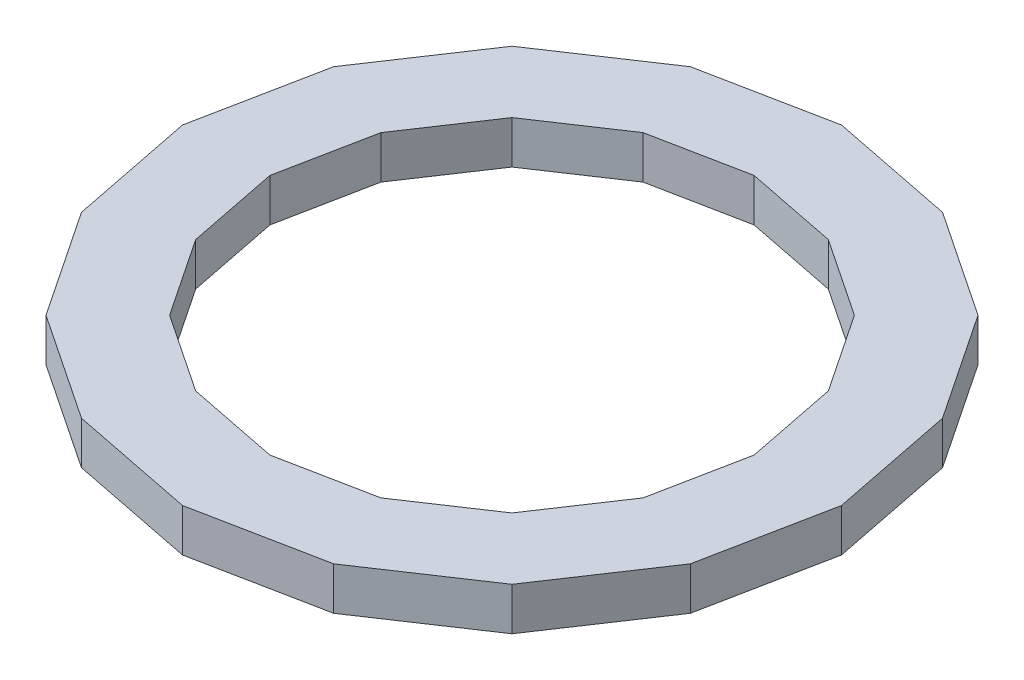
ISO-10303-21;
HEADER;
FILE_DESCRIPTION(('STEP AP214'),'2;1');
FILE_NAME('part.step','',(''),(''),'','','');
FILE_SCHEMA(('AUTOMOTIVE_DESIGN { 1 0 10303 214 1 1 1 1 }'));
ENDSEC;
DATA;
#1=APPLICATION_CONTEXT('core data for automotive mechanical design processes');
#2=APPLICATION_PROTOCOL_DEFINITION('international standard','automotive_design',2000,#1);
#3=PRODUCT_CONTEXT('',#1,'mechanical');
#4=PRODUCT('Part','Part','',(#3));
#5=PRODUCT_RELATED_PRODUCT_CATEGORY('part','',(#4));
#6=PRODUCT_DEFINITION_FORMATION('','',#4);
#7=PRODUCT_DEFINITION_CONTEXT('part definition',#1,'design');
#8=PRODUCT_DEFINITION('design','',#6,#7);
#9=PRODUCT_DEFINITION_SHAPE('','',#8);
#10=(LENGTH_UNIT() NAMED_UNIT(*) SI_UNIT(.MILLI.,.METRE.));
#11=(NAMED_UNIT(*) PLANE_ANGLE_UNIT() SI_UNIT($,.RADIAN.));
#12=(NAMED_UNIT(*) SI_UNIT($,.STERADIAN.) SOLID_ANGLE_UNIT());
#13=UNCERTAINTY_MEASURE_WITH_UNIT(LENGTH_MEASURE(1.E-05),#10,'distance_accuracy_value','');
#14=(GEOMETRIC_REPRESENTATION_CONTEXT(3) GLOBAL_UNCERTAINTY_ASSIGNED_CONTEXT((#13)) GLOBAL_UNIT_ASSIGNED_CONTEXT((#10,
#11,#12)) REPRESENTATION_CONTEXT('',''));
#15=CARTESIAN_POINT('',(0.,0.,0.));
#16=DIRECTION('',(0.,0.,1.));
#17=DIRECTION('',(1.,0.,0.));
#18=AXIS2_PLACEMENT_3D('',#15,#16,#17);
#19=CARTESIAN_POINT('',(0.,19.05,0.));
#20=DIRECTION('',(0.,1.,0.));
#21=DIRECTION('',(0.,0.,1.));
#22=AXIS2_PLACEMENT_3D('',#19,#20,#21);
#23=PLANE('',#22);
#24=DIRECTION('',(0.195090322016117,0.,-0.980785280403233));
#25=VECTOR('',#24,1.);
#26=CARTESIAN_POINT('',(135.321205935206,19.05,56.0518787750433));
#27=LINE('',#26,#25);
#28=CARTESIAN_POINT('',(135.321205935206,19.05,56.0518787750433));
#29=VERTEX_POINT('',#28);
#30=CARTESIAN_POINT('',(146.470617838427,19.05,-1.60288341468619E-12));
#31=VERTEX_POINT('',#30);
#32=EDGE_CURVE('E385',#29,#31,#27,.T.);
#33=ORIENTED_EDGE('',*,*,#32,.T.);
#34=DIRECTION('',(-0.195090322016139,0.,-0.980785280403228));
#35=VECTOR('',#34,1.);
#36=CARTESIAN_POINT('',(146.470617838427,19.05,-1.60288341468619E-12));
#37=LINE('',#36,#35);
#38=CARTESIAN_POINT('',(135.321205935205,19.05,-56.0518787750461));
#39=VERTEX_POINT('',#38);
#40=EDGE_CURVE('E388',#31,#39,#37,.T.);
#41=ORIENTED_EDGE('',*,*,#40,.T.);
#42=DIRECTION('',(-0.555570233019611,0.,-0.831469612302539));
#43=VECTOR('',#42,1.);
#44=CARTESIAN_POINT('',(135.321205935205,19.05,-56.0518787750461));
#45=LINE('',#44,#43);
#46=CARTESIAN_POINT('',(103.570367118134,19.05,-103.570367118136));
#47=VERTEX_POINT('',#46);
#48=EDGE_CURVE('E391',#39,#47,#45,.T.);
#49=ORIENTED_EDGE('',*,*,#48,.T.);
#50=DIRECTION('',(-0.831469612302551,0.,-0.555570233019593));
#51=VECTOR('',#50,1.);
#52=CARTESIAN_POINT('',(103.570367118134,19.05,-103.570367118136));
#53=LINE('',#52,#51);
#54=CARTESIAN_POINT('',(56.0518787750433,19.05,-135.321205935206));
#55=VERTEX_POINT('',#54);
#56=EDGE_CURVE('E394',#47,#55,#53,.T.);
#57=ORIENTED_EDGE('',*,*,#56,.T.);
#58=DIRECTION('',(-0.980785280403233,0.,-0.195090322016117));
#59=VECTOR('',#58,1.);
#60=CARTESIAN_POINT('',(56.0518787750433,19.05,-135.321205935206));
#61=LINE('',#60,#59);
#62=CARTESIAN_POINT('',(-1.69308296480161E-12,19.05,-146.470617838427));
#63=VERTEX_POINT('',#62);
#64=EDGE_CURVE('E397',#55,#63,#61,.T.);
#65=ORIENTED_EDGE('',*,*,#64,.T.);
#66=DIRECTION('',(-0.980785280403228,0.,0.195090322016139));
#67=VECTOR('',#66,1.);
#68=CARTESIAN_POINT('',(-1.69308296480161E-12,19.05,-146.470617838427));
#69=LINE('',#68,#67);
#70=CARTESIAN_POINT('',(-56.0518787750461,19.05,-135.321205935205));
#71=VERTEX_POINT('',#70);
#72=EDGE_CURVE('E400',#63,#71,#69,.T.);
#73=ORIENTED_EDGE('',*,*,#72,.T.);
#74=DIRECTION('',(-0.831469612302539,0.,0.555570233019611));
#75=VECTOR('',#74,1.);
#76=CARTESIAN_POINT('',(-56.0518787750461,19.05,-135.321205935205));
#77=LINE('',#76,#75);
#78=CARTESIAN_POINT('',(-103.570367118136,19.05,-103.570367118134));
#79=VERTEX_POINT('',#78);
#80=EDGE_CURVE('E402',#71,#79,#77,.T.);
#81=ORIENTED_EDGE('',*,*,#80,.T.);
#82=DIRECTION('',(-0.555570233019593,0.,0.831469612302551));
#83=VECTOR('',#82,1.);
#84=CARTESIAN_POINT('',(-103.570367118136,19.05,-103.570367118134));
#85=LINE('',#84,#83);
#86=CARTESIAN_POINT('',(-135.321205935206,19.05,-56.0518787750431));
#87=VERTEX_POINT('',#86);
#88=EDGE_CURVE('E404',#79,#87,#85,.T.);
#89=ORIENTED_EDGE('',*,*,#88,.T.);
#90=DIRECTION('',(-0.195090322016117,0.,0.980785280403233));
#91=VECTOR('',#90,1.);
#92=CARTESIAN_POINT('',(-135.321205935206,19.05,-56.0518787750431));
#93=LINE('',#92,#91);
#94=CARTESIAN_POINT('',(-146.470617838427,19.05,1.65838521613107E-12));
#95=VERTEX_POINT('',#94);
#96=EDGE_CURVE('E406',#87,#95,#93,.T.);
#97=ORIENTED_EDGE('',*,*,#96,.T.);
#98=DIRECTION('',(0.195090322016139,0.,0.980785280403228));
#99=VECTOR('',#98,1.);
#100=CARTESIAN_POINT('',(-146.470617838427,19.05,1.65838521613107E-12));
#101=LINE('',#100,#99);
#102=CARTESIAN_POINT('',(-135.321205935205,19.05,56.0518787750461));
#103=VERTEX_POINT('',#102);
#104=EDGE_CURVE('E408',#95,#103,#101,.T.);
#105=ORIENTED_EDGE('',*,*,#104,.T.);
#106=DIRECTION('',(0.555570233019611,0.,0.831469612302539));
#107=VECTOR('',#106,1.);
#108=CARTESIAN_POINT('',(-135.321205935205,19.05,56.0518787750461));
#109=LINE('',#108,#107);
#110=CARTESIAN_POINT('',(-103.570367118134,19.05,103.570367118136));
#111=VERTEX_POINT('',#110);
#112=EDGE_CURVE('E410',#103,#111,#109,.T.);
#113=ORIENTED_EDGE('',*,*,#112,.T.);
#114=DIRECTION('',(0.831469612302551,0.,0.555570233019593));
#115=VECTOR('',#114,1.);
#116=CARTESIAN_POINT('',(-103.570367118134,19.05,103.570367118136));
#117=LINE('',#116,#115);
#118=CARTESIAN_POINT('',(-56.0518787750431,19.05,135.321205935206));
#119=VERTEX_POINT('',#118);
#120=EDGE_CURVE('E412',#111,#119,#117,.T.);
#121=ORIENTED_EDGE('',*,*,#120,.T.);
#122=DIRECTION('',(0.980785280403233,0.,0.195090322016118));
#123=VECTOR('',#122,1.);
#124=CARTESIAN_POINT('',(-56.0518787750431,19.05,135.321205935206));
#125=LINE('',#124,#123);
#126=CARTESIAN_POINT('',(1.5317509390031E-12,19.05,146.470617838427));
#127=VERTEX_POINT('',#126);
#128=EDGE_CURVE('E414',#119,#127,#125,.T.);
#129=ORIENTED_EDGE('',*,*,#128,.T.);
#130=DIRECTION('',(0.980785280403228,0.,-0.195090322016139));
#131=VECTOR('',#130,1.);
#132=CARTESIAN_POINT('',(1.5317509390031E-12,19.05,146.470617838427));
#133=LINE('',#132,#131);
#134=CARTESIAN_POINT('',(56.0518787750462,19.05,135.321205935205));
#135=VERTEX_POINT('',#134);
#136=EDGE_CURVE('E416',#127,#135,#133,.T.);
#137=ORIENTED_EDGE('',*,*,#136,.T.);
#138=DIRECTION('',(0.831469612302539,0.,-0.555570233019611));
#139=VECTOR('',#138,1.);
#140=CARTESIAN_POINT('',(56.0518787750462,19.05,135.321205935205));
#141=LINE('',#140,#139);
#142=CARTESIAN_POINT('',(103.570367118136,19.05,103.570367118134));
#143=VERTEX_POINT('',#142);
#144=EDGE_CURVE('E418',#135,#143,#141,.T.);
#145=ORIENTED_EDGE('',*,*,#144,.T.);
#146=DIRECTION('',(0.555570233019593,0.,-0.831469612302551));
#147=VECTOR('',#146,1.);
#148=CARTESIAN_POINT('',(103.570367118136,19.05,103.570367118134));
#149=LINE('',#148,#147);
#150=EDGE_CURVE('E420',#143,#29,#149,.T.);
#151=ORIENTED_EDGE('',*,*,#150,.T.);
#152=EDGE_LOOP('',(#33,#41,#49,#57,#65,#73,#81,#89,#97,#105,#113,#121,#129,#137,#145,#151));
#153=FACE_BOUND('',#152,.T.);
#154=DIRECTION('',(-0.195090322016139,0.,-0.980785280403228));
#155=VECTOR('',#154,1.);
#156=CARTESIAN_POINT('',(107.62419471069,19.05,-1.21440166598668E-12));
#157=LINE('',#156,#155);
#158=CARTESIAN_POINT('',(107.62419471069,19.05,-1.21440166598668E-12));
#159=VERTEX_POINT('',#158);
#160=CARTESIAN_POINT('',(99.4317906962157,19.05,-41.1859962374167));
#161=VERTEX_POINT('',#160);
#162=EDGE_CURVE('E252',#159,#161,#157,.T.);
#163=ORIENTED_EDGE('',*,*,#162,.F.);
#164=DIRECTION('',(0.195090322016118,0.,-0.980785280403233));
#165=VECTOR('',#164,1.);
#166=CARTESIAN_POINT('',(99.4317906962166,19.05,41.1859962374146));
#167=LINE('',#166,#165);
#168=CARTESIAN_POINT('',(99.4317906962166,19.05,41.1859962374146));
#169=VERTEX_POINT('',#168);
#170=EDGE_CURVE('E244',#169,#159,#167,.T.);
#171=ORIENTED_EDGE('',*,*,#170,.F.);
#172=DIRECTION('',(0.555570233019593,0.,-0.831469612302552));
#173=VECTOR('',#172,1.);
#174=CARTESIAN_POINT('',(76.1017978996712,19.05,76.1017978996696));
#175=LINE('',#174,#173);
#176=CARTESIAN_POINT('',(76.1017978996712,19.05,76.1017978996696));
#177=VERTEX_POINT('',#176);
#178=EDGE_CURVE('E302',#177,#169,#175,.T.);
#179=ORIENTED_EDGE('',*,*,#178,.F.);
#180=DIRECTION('',(0.831469612302539,0.,-0.555570233019611));
#181=VECTOR('',#180,1.);
#182=CARTESIAN_POINT('',(41.1859962374168,19.05,99.4317906962157));
#183=LINE('',#182,#181);
#184=CARTESIAN_POINT('',(41.1859962374168,19.05,99.4317906962157));
#185=VERTEX_POINT('',#184);
#186=EDGE_CURVE('E299',#185,#177,#183,.T.);
#187=ORIENTED_EDGE('',*,*,#186,.F.);
#188=DIRECTION('',(0.980785280403228,0.,-0.195090322016139));
#189=VECTOR('',#188,1.);
#190=CARTESIAN_POINT('',(1.19853946211757E-12,19.05,107.62419471069));
#191=LINE('',#190,#189);
#192=CARTESIAN_POINT('',(1.19853946211757E-12,19.05,107.62419471069));
#193=VERTEX_POINT('',#192);
#194=EDGE_CURVE('E297',#193,#185,#191,.T.);
#195=ORIENTED_EDGE('',*,*,#194,.F.);
#196=DIRECTION('',(0.980785280403233,0.,0.195090322016117));
#197=VECTOR('',#196,1.);
#198=CARTESIAN_POINT('',(-41.1859962374146,19.05,99.4317906962166));
#199=LINE('',#198,#197);
#200=CARTESIAN_POINT('',(-41.1859962374146,19.05,99.4317906962166));
#201=VERTEX_POINT('',#200);
#202=EDGE_CURVE('E295',#201,#193,#199,.T.);
#203=ORIENTED_EDGE('',*,*,#202,.F.);
#204=DIRECTION('',(0.831469612302551,0.,0.555570233019593));
#205=VECTOR('',#204,1.);
#206=CARTESIAN_POINT('',(-76.1017978996696,19.05,76.1017978996713));
#207=LINE('',#206,#205);
#208=CARTESIAN_POINT('',(-76.1017978996696,19.05,76.1017978996713));
#209=VERTEX_POINT('',#208);
#210=EDGE_CURVE('E292',#209,#201,#207,.T.);
#211=ORIENTED_EDGE('',*,*,#210,.F.);
#212=DIRECTION('',(0.555570233019611,0.,0.831469612302539));
#213=VECTOR('',#212,1.);
#214=CARTESIAN_POINT('',(-99.4317906962158,19.05,41.1859962374168));
#215=LINE('',#214,#213);
#216=CARTESIAN_POINT('',(-99.4317906962158,19.05,41.1859962374168));
#217=VERTEX_POINT('',#216);
#218=EDGE_CURVE('E290',#217,#209,#215,.T.);
#219=ORIENTED_EDGE('',*,*,#218,.F.);
#220=DIRECTION('',(0.195090322016139,0.,0.980785280403228));
#221=VECTOR('',#220,1.);
#222=CARTESIAN_POINT('',(-107.62419471069,19.05,1.20736281239143E-12));
#223=LINE('',#222,#221);
#224=CARTESIAN_POINT('',(-107.62419471069,19.05,1.20736281239143E-12));
#225=VERTEX_POINT('',#224);
#226=EDGE_CURVE('E288',#225,#217,#223,.T.);
#227=ORIENTED_EDGE('',*,*,#226,.F.);
#228=DIRECTION('',(-0.195090322016118,0.,0.980785280403233));
#229=VECTOR('',#228,1.);
#230=CARTESIAN_POINT('',(-99.4317906962167,19.05,-41.1859962374146));
#231=LINE('',#230,#229);
#232=CARTESIAN_POINT('',(-99.4317906962167,19.05,-41.1859962374146));
#233=VERTEX_POINT('',#232);
#234=EDGE_CURVE('E286',#233,#225,#231,.T.);
#235=ORIENTED_EDGE('',*,*,#234,.F.);
#236=DIRECTION('',(-0.555570233019593,0.,0.831469612302552));
#237=VECTOR('',#236,1.);
#238=CARTESIAN_POINT('',(-76.1017978996713,19.05,-76.1017978996695));
#239=LINE('',#238,#237);
#240=CARTESIAN_POINT('',(-76.1017978996713,19.05,-76.1017978996695));
#241=VERTEX_POINT('',#240);
#242=EDGE_CURVE('E284',#241,#233,#239,.T.);
#243=ORIENTED_EDGE('',*,*,#242,.F.);
#244=DIRECTION('',(-0.831469612302539,0.,0.555570233019612));
#245=VECTOR('',#244,1.);
#246=CARTESIAN_POINT('',(-41.1859962374168,19.05,-99.4317906962157));
#247=LINE('',#246,#245);
#248=CARTESIAN_POINT('',(-41.1859962374168,19.05,-99.4317906962157));
#249=VERTEX_POINT('',#248);
#250=EDGE_CURVE('E282',#249,#241,#247,.T.);
#251=ORIENTED_EDGE('',*,*,#250,.F.);
#252=DIRECTION('',(-0.980785280403228,0.,0.195090322016139));
#253=VECTOR('',#252,1.);
#254=CARTESIAN_POINT('',(-1.22818363873053E-12,19.05,-107.62419471069));
#255=LINE('',#254,#253);
#256=CARTESIAN_POINT('',(-1.22818363873053E-12,19.05,-107.62419471069));
#257=VERTEX_POINT('',#256);
#258=EDGE_CURVE('E280',#257,#249,#255,.T.);
#259=ORIENTED_EDGE('',*,*,#258,.F.);
#260=DIRECTION('',(-0.980785280403233,0.,-0.195090322016117));
#261=VECTOR('',#260,1.);
#262=CARTESIAN_POINT('',(41.1859962374146,19.05,-99.4317906962166));
#263=LINE('',#262,#261);
#264=CARTESIAN_POINT('',(41.1859962374146,19.05,-99.4317906962166));
#265=VERTEX_POINT('',#264);
#266=EDGE_CURVE('E277',#265,#257,#263,.T.);
#267=ORIENTED_EDGE('',*,*,#266,.F.);
#268=DIRECTION('',(-0.831469612302552,0.,-0.555570233019593));
#269=VECTOR('',#268,1.);
#270=CARTESIAN_POINT('',(76.1017978996695,19.05,-76.1017978996713));
#271=LINE('',#270,#269);
#272=CARTESIAN_POINT('',(76.1017978996695,19.05,-76.1017978996713));
#273=VERTEX_POINT('',#272);
#274=EDGE_CURVE('E272',#273,#265,#271,.T.);
#275=ORIENTED_EDGE('',*,*,#274,.F.);
#276=DIRECTION('',(-0.555570233019612,0.,-0.831469612302539));
#277=VECTOR('',#276,1.);
#278=CARTESIAN_POINT('',(99.4317906962157,19.05,-41.1859962374167));
#279=LINE('',#278,#277);
#280=EDGE_CURVE('E265',#161,#273,#279,.T.);
#281=ORIENTED_EDGE('',*,*,#280,.F.);
#282=EDGE_LOOP('',(#163,#171,#179,#187,#195,#203,#211,#219,#227,#235,#243,#251,#259,#267,#275,#281));
#283=FACE_BOUND('',#282,.T.);
#284=ADVANCED_FACE('F35',(#153,#283),#23,.T.);
#285=CARTESIAN_POINT('',(0.,0.,0.));
#286=DIRECTION('',(0.,1.,0.));
#287=DIRECTION('',(0.,0.,1.));
#288=AXIS2_PLACEMENT_3D('',#285,#286,#287);
#289=PLANE('',#288);
#290=DIRECTION('',(0.195090322016117,0.,-0.980785280403233));
#291=VECTOR('',#290,1.);
#292=CARTESIAN_POINT('',(135.321205935206,0.,56.0518787750433));
#293=LINE('',#292,#291);
#294=CARTESIAN_POINT('',(135.321205935206,0.,56.0518787750433));
#295=VERTEX_POINT('',#294);
#296=CARTESIAN_POINT('',(146.470617838427,0.,-1.60288341468619E-12));
#297=VERTEX_POINT('',#296);
#298=EDGE_CURVE('E260',#295,#297,#293,.T.);
#299=ORIENTED_EDGE('',*,*,#298,.F.);
#300=DIRECTION('',(0.555570233019593,0.,-0.831469612302551));
#301=VECTOR('',#300,1.);
#302=CARTESIAN_POINT('',(103.570367118136,0.,103.570367118134));
#303=LINE('',#302,#301);
#304=CARTESIAN_POINT('',(103.570367118136,0.,103.570367118134));
#305=VERTEX_POINT('',#304);
#306=EDGE_CURVE('E389',#305,#295,#303,.T.);
#307=ORIENTED_EDGE('',*,*,#306,.F.);
#308=DIRECTION('',(0.831469612302539,0.,-0.555570233019611));
#309=VECTOR('',#308,1.);
#310=CARTESIAN_POINT('',(56.0518787750462,0.,135.321205935205));
#311=LINE('',#310,#309);
#312=CARTESIAN_POINT('',(56.0518787750462,0.,135.321205935205));
#313=VERTEX_POINT('',#312);
#314=EDGE_CURVE('E457',#313,#305,#311,.T.);
#315=ORIENTED_EDGE('',*,*,#314,.F.);
#316=DIRECTION('',(0.980785280403228,0.,-0.195090322016139));
#317=VECTOR('',#316,1.);
#318=CARTESIAN_POINT('',(1.5317509390031E-12,0.,146.470617838427));
#319=LINE('',#318,#317);
#320=CARTESIAN_POINT('',(1.5317509390031E-12,0.,146.470617838427));
#321=VERTEX_POINT('',#320);
#322=EDGE_CURVE('E454',#321,#313,#319,.T.);
#323=ORIENTED_EDGE('',*,*,#322,.F.);
#324=DIRECTION('',(0.980785280403233,0.,0.195090322016118));
#325=VECTOR('',#324,1.);
#326=CARTESIAN_POINT('',(-56.0518787750431,0.,135.321205935206));
#327=LINE('',#326,#325);
#328=CARTESIAN_POINT('',(-56.0518787750431,0.,135.321205935206));
#329=VERTEX_POINT('',#328);
#330=EDGE_CURVE('E452',#329,#321,#327,.T.);
#331=ORIENTED_EDGE('',*,*,#330,.F.);
#332=DIRECTION('',(0.831469612302551,0.,0.555570233019593));
#333=VECTOR('',#332,1.);
#334=CARTESIAN_POINT('',(-103.570367118134,0.,103.570367118136));
#335=LINE('',#334,#333);
#336=CARTESIAN_POINT('',(-103.570367118134,0.,103.570367118136));
#337=VERTEX_POINT('',#336);
#338=EDGE_CURVE('E450',#337,#329,#335,.T.);
#339=ORIENTED_EDGE('',*,*,#338,.F.);
#340=DIRECTION('',(0.555570233019611,0.,0.831469612302539));
#341=VECTOR('',#340,1.);
#342=CARTESIAN_POINT('',(-135.321205935205,0.,56.0518787750461));
#343=LINE('',#342,#341);
#344=CARTESIAN_POINT('',(-135.321205935205,0.,56.0518787750461));
#345=VERTEX_POINT('',#344);
#346=EDGE_CURVE('E447',#345,#337,#343,.T.);
#347=ORIENTED_EDGE('',*,*,#346,.F.);
#348=DIRECTION('',(0.195090322016139,0.,0.980785280403228));
#349=VECTOR('',#348,1.);
#350=CARTESIAN_POINT('',(-146.470617838427,0.,1.65838521613107E-12));
#351=LINE('',#350,#349);
#352=CARTESIAN_POINT('',(-146.470617838427,0.,1.65838521613107E-12));
#353=VERTEX_POINT('',#352);
#354=EDGE_CURVE('E445',#353,#345,#351,.T.);
#355=ORIENTED_EDGE('',*,*,#354,.F.);
#356=DIRECTION('',(-0.195090322016117,0.,0.980785280403233));
#357=VECTOR('',#356,1.);
#358=CARTESIAN_POINT('',(-135.321205935206,0.,-56.0518787750431));
#359=LINE('',#358,#357);
#360=CARTESIAN_POINT('',(-135.321205935206,0.,-56.0518787750431));
#361=VERTEX_POINT('',#360);
#362=EDGE_CURVE('E443',#361,#353,#359,.T.);
#363=ORIENTED_EDGE('',*,*,#362,.F.);
#364=DIRECTION('',(-0.555570233019593,0.,0.831469612302551));
#365=VECTOR('',#364,1.);
#366=CARTESIAN_POINT('',(-103.570367118136,0.,-103.570367118134));
#367=LINE('',#366,#365);
#368=CARTESIAN_POINT('',(-103.570367118136,0.,-103.570367118134));
#369=VERTEX_POINT('',#368);
#370=EDGE_CURVE('E441',#369,#361,#367,.T.);
#371=ORIENTED_EDGE('',*,*,#370,.F.);
#372=DIRECTION('',(-0.831469612302539,0.,0.555570233019611));
#373=VECTOR('',#372,1.);
#374=CARTESIAN_POINT('',(-56.0518787750461,0.,-135.321205935205));
#375=LINE('',#374,#373);
#376=CARTESIAN_POINT('',(-56.0518787750461,0.,-135.321205935205));
#377=VERTEX_POINT('',#376);
#378=EDGE_CURVE('E439',#377,#369,#375,.T.);
#379=ORIENTED_EDGE('',*,*,#378,.F.);
#380=DIRECTION('',(-0.980785280403228,0.,0.195090322016139));
#381=VECTOR('',#380,1.);
#382=CARTESIAN_POINT('',(-1.69308296480161E-12,0.,-146.470617838427));
#383=LINE('',#382,#381);
#384=CARTESIAN_POINT('',(-1.69308296480161E-12,0.,-146.470617838427));
#385=VERTEX_POINT('',#384);
#386=EDGE_CURVE('E437',#385,#377,#383,.T.);
#387=ORIENTED_EDGE('',*,*,#386,.F.);
#388=DIRECTION('',(-0.980785280403233,0.,-0.195090322016117));
#389=VECTOR('',#388,1.);
#390=CARTESIAN_POINT('',(56.0518787750433,0.,-135.321205935206));
#391=LINE('',#390,#389);
#392=CARTESIAN_POINT('',(56.0518787750433,0.,-135.321205935206));
#393=VERTEX_POINT('',#392);
#394=EDGE_CURVE('E434',#393,#385,#391,.T.);
#395=ORIENTED_EDGE('',*,*,#394,.F.);
#396=DIRECTION('',(-0.831469612302551,0.,-0.555570233019593));
#397=VECTOR('',#396,1.);
#398=CARTESIAN_POINT('',(103.570367118134,0.,-103.570367118136));
#399=LINE('',#398,#397);
#400=CARTESIAN_POINT('',(103.570367118134,0.,-103.570367118136));
#401=VERTEX_POINT('',#400);
#402=EDGE_CURVE('E431',#401,#393,#399,.T.);
#403=ORIENTED_EDGE('',*,*,#402,.F.);
#404=DIRECTION('',(-0.555570233019611,0.,-0.831469612302539));
#405=VECTOR('',#404,1.);
#406=CARTESIAN_POINT('',(135.321205935205,0.,-56.0518787750461));
#407=LINE('',#406,#405);
#408=CARTESIAN_POINT('',(135.321205935205,0.,-56.0518787750461));
#409=VERTEX_POINT('',#408);
#410=EDGE_CURVE('E428',#409,#401,#407,.T.);
#411=ORIENTED_EDGE('',*,*,#410,.F.);
#412=DIRECTION('',(-0.195090322016139,0.,-0.980785280403228));
#413=VECTOR('',#412,1.);
#414=CARTESIAN_POINT('',(146.470617838427,0.,-1.60288341468619E-12));
#415=LINE('',#414,#413);
#416=EDGE_CURVE('E426',#297,#409,#415,.T.);
#417=ORIENTED_EDGE('',*,*,#416,.F.);
#418=EDGE_LOOP('',(#299,#307,#315,#323,#331,#339,#347,#355,#363,#371,#379,#387,#395,#403,#411,#417));
#419=FACE_BOUND('',#418,.T.);
#420=DIRECTION('',(0.195090322016118,0.,-0.980785280403233));
#421=VECTOR('',#420,1.);
#422=CARTESIAN_POINT('',(99.4317906962166,0.,41.1859962374146));
#423=LINE('',#422,#421);
#424=CARTESIAN_POINT('',(99.4317906962166,0.,41.1859962374146));
#425=VERTEX_POINT('',#424);
#426=CARTESIAN_POINT('',(107.62419471069,0.,-1.21440166598668E-12));
#427=VERTEX_POINT('',#426);
#428=EDGE_CURVE('E58',#425,#427,#423,.T.);
#429=ORIENTED_EDGE('',*,*,#428,.T.);
#430=DIRECTION('',(-0.195090322016139,0.,-0.980785280403228));
#431=VECTOR('',#430,1.);
#432=CARTESIAN_POINT('',(107.62419471069,0.,-1.21440166598668E-12));
#433=LINE('',#432,#431);
#434=CARTESIAN_POINT('',(99.4317906962157,0.,-41.1859962374167));
#435=VERTEX_POINT('',#434);
#436=EDGE_CURVE('E259',#427,#435,#433,.T.);
#437=ORIENTED_EDGE('',*,*,#436,.T.);
#438=DIRECTION('',(-0.555570233019612,0.,-0.831469612302539));
#439=VECTOR('',#438,1.);
#440=CARTESIAN_POINT('',(99.4317906962157,0.,-41.1859962374167));
#441=LINE('',#440,#439);
#442=CARTESIAN_POINT('',(76.1017978996695,0.,-76.1017978996713));
#443=VERTEX_POINT('',#442);
#444=EDGE_CURVE('E309',#435,#443,#441,.T.);
#445=ORIENTED_EDGE('',*,*,#444,.T.);
#446=DIRECTION('',(-0.831469612302552,0.,-0.555570233019593));
#447=VECTOR('',#446,1.);
#448=CARTESIAN_POINT('',(76.1017978996695,0.,-76.1017978996713));
#449=LINE('',#448,#447);
#450=CARTESIAN_POINT('',(41.1859962374146,0.,-99.4317906962166));
#451=VERTEX_POINT('',#450);
#452=EDGE_CURVE('E313',#443,#451,#449,.T.);
#453=ORIENTED_EDGE('',*,*,#452,.T.);
#454=DIRECTION('',(-0.980785280403233,0.,-0.195090322016117));
#455=VECTOR('',#454,1.);
#456=CARTESIAN_POINT('',(41.1859962374146,0.,-99.4317906962166));
#457=LINE('',#456,#455);
#458=CARTESIAN_POINT('',(-1.22818363873053E-12,0.,-107.62419471069));
#459=VERTEX_POINT('',#458);
#460=EDGE_CURVE('E317',#451,#459,#457,.T.);
#461=ORIENTED_EDGE('',*,*,#460,.T.);
#462=DIRECTION('',(-0.980785280403228,0.,0.195090322016139));
#463=VECTOR('',#462,1.);
#464=CARTESIAN_POINT('',(-1.22818363873053E-12,0.,-107.62419471069));
#465=LINE('',#464,#463);
#466=CARTESIAN_POINT('',(-41.1859962374168,0.,-99.4317906962157));
#467=VERTEX_POINT('',#466);
#468=EDGE_CURVE('E320',#459,#467,#465,.T.);
#469=ORIENTED_EDGE('',*,*,#468,.T.);
#470=DIRECTION('',(-0.831469612302539,0.,0.555570233019612));
#471=VECTOR('',#470,1.);
#472=CARTESIAN_POINT('',(-41.1859962374168,0.,-99.4317906962157));
#473=LINE('',#472,#471);
#474=CARTESIAN_POINT('',(-76.1017978996713,0.,-76.1017978996695));
#475=VERTEX_POINT('',#474);
#476=EDGE_CURVE('E323',#467,#475,#473,.T.);
#477=ORIENTED_EDGE('',*,*,#476,.T.);
#478=DIRECTION('',(-0.555570233019593,0.,0.831469612302552));
#479=VECTOR('',#478,1.);
#480=CARTESIAN_POINT('',(-76.1017978996713,0.,-76.1017978996695));
#481=LINE('',#480,#479);
#482=CARTESIAN_POINT('',(-99.4317906962167,0.,-41.1859962374146));
#483=VERTEX_POINT('',#482);
#484=EDGE_CURVE('E327',#475,#483,#481,.T.);
#485=ORIENTED_EDGE('',*,*,#484,.T.);
#486=DIRECTION('',(-0.195090322016118,0.,0.980785280403233));
#487=VECTOR('',#486,1.);
#488=CARTESIAN_POINT('',(-99.4317906962167,0.,-41.1859962374146));
#489=LINE('',#488,#487);
#490=CARTESIAN_POINT('',(-107.62419471069,0.,1.20736281239143E-12));
#491=VERTEX_POINT('',#490);
#492=EDGE_CURVE('E330',#483,#491,#489,.T.);
#493=ORIENTED_EDGE('',*,*,#492,.T.);
#494=DIRECTION('',(0.195090322016139,0.,0.980785280403228));
#495=VECTOR('',#494,1.);
#496=CARTESIAN_POINT('',(-107.62419471069,0.,1.20736281239143E-12));
#497=LINE('',#496,#495);
#498=CARTESIAN_POINT('',(-99.4317906962158,0.,41.1859962374168));
#499=VERTEX_POINT('',#498);
#500=EDGE_CURVE('E333',#491,#499,#497,.T.);
#501=ORIENTED_EDGE('',*,*,#500,.T.);
#502=DIRECTION('',(0.555570233019611,0.,0.831469612302539));
#503=VECTOR('',#502,1.);
#504=CARTESIAN_POINT('',(-99.4317906962158,0.,41.1859962374168));
#505=LINE('',#504,#503);
#506=CARTESIAN_POINT('',(-76.1017978996696,0.,76.1017978996713));
#507=VERTEX_POINT('',#506);
#508=EDGE_CURVE('E336',#499,#507,#505,.T.);
#509=ORIENTED_EDGE('',*,*,#508,.T.);
#510=DIRECTION('',(0.831469612302551,0.,0.555570233019593));
#511=VECTOR('',#510,1.);
#512=CARTESIAN_POINT('',(-76.1017978996696,0.,76.1017978996713));
#513=LINE('',#512,#511);
#514=CARTESIAN_POINT('',(-41.1859962374146,0.,99.4317906962166));
#515=VERTEX_POINT('',#514);
#516=EDGE_CURVE('E340',#507,#515,#513,.T.);
#517=ORIENTED_EDGE('',*,*,#516,.T.);
#518=DIRECTION('',(0.980785280403233,0.,0.195090322016117));
#519=VECTOR('',#518,1.);
#520=CARTESIAN_POINT('',(-41.1859962374146,0.,99.4317906962166));
#521=LINE('',#520,#519);
#522=CARTESIAN_POINT('',(1.19853946211757E-12,0.,107.62419471069));
#523=VERTEX_POINT('',#522);
#524=EDGE_CURVE('E344',#515,#523,#521,.T.);
#525=ORIENTED_EDGE('',*,*,#524,.T.);
#526=DIRECTION('',(0.980785280403228,0.,-0.195090322016139));
#527=VECTOR('',#526,1.);
#528=CARTESIAN_POINT('',(1.19853946211757E-12,0.,107.62419471069));
#529=LINE('',#528,#527);
#530=CARTESIAN_POINT('',(41.1859962374168,0.,99.4317906962157));
#531=VERTEX_POINT('',#530);
#532=EDGE_CURVE('E347',#523,#531,#529,.T.);
#533=ORIENTED_EDGE('',*,*,#532,.T.);
#534=DIRECTION('',(0.831469612302539,0.,-0.555570233019611));
#535=VECTOR('',#534,1.);
#536=CARTESIAN_POINT('',(41.1859962374168,0.,99.4317906962157));
#537=LINE('',#536,#535);
#538=CARTESIAN_POINT('',(76.1017978996712,0.,76.1017978996696));
#539=VERTEX_POINT('',#538);
#540=EDGE_CURVE('E350',#531,#539,#537,.T.);
#541=ORIENTED_EDGE('',*,*,#540,.T.);
#542=DIRECTION('',(0.555570233019593,0.,-0.831469612302552));
#543=VECTOR('',#542,1.);
#544=CARTESIAN_POINT('',(76.1017978996712,0.,76.1017978996696));
#545=LINE('',#544,#543);
#546=EDGE_CURVE('E253',#539,#425,#545,.T.);
#547=ORIENTED_EDGE('',*,*,#546,.T.);
#548=EDGE_LOOP('',(#429,#437,#445,#453,#461,#469,#477,#485,#493,#501,#509,#517,#525,#533,#541,#547));
#549=FACE_BOUND('',#548,.T.);
#550=ADVANCED_FACE('F517',(#419,#549),#289,.F.);
#551=CARTESIAN_POINT('',(135.321205935206,19.05,56.0518787750433));
#552=DIRECTION('',(-0.980785280403233,0.,-0.195090322016117));
#553=DIRECTION('',(-0.195090322016117,0.,0.980785280403233));
#554=AXIS2_PLACEMENT_3D('',#551,#552,#553);
#555=PLANE('',#554);
#556=ORIENTED_EDGE('',*,*,#298,.T.);
#557=DIRECTION('',(0.,-1.,0.));
#558=VECTOR('',#557,1.);
#559=CARTESIAN_POINT('',(146.470617838427,19.05,-1.60288341468619E-12));
#560=LINE('',#559,#558);
#561=EDGE_CURVE('E11',#31,#297,#560,.T.);
#562=ORIENTED_EDGE('',*,*,#561,.F.);
#563=ORIENTED_EDGE('',*,*,#32,.F.);
#564=DIRECTION('',(0.,-1.,0.));
#565=VECTOR('',#564,1.);
#566=CARTESIAN_POINT('',(135.321205935206,19.05,56.0518787750433));
#567=LINE('',#566,#565);
#568=EDGE_CURVE('E423',#29,#295,#567,.T.);
#569=ORIENTED_EDGE('',*,*,#568,.T.);
#570=EDGE_LOOP('',(#556,#562,#563,#569));
#571=FACE_BOUND('',#570,.T.);
#572=ADVANCED_FACE('F37',(#571),#555,.F.);
#573=CARTESIAN_POINT('',(146.470617838427,19.05,-1.60288341468619E-12));
#574=DIRECTION('',(-0.980785280403228,0.,0.195090322016139));
#575=DIRECTION('',(0.195090322016139,0.,0.980785280403229));
#576=AXIS2_PLACEMENT_3D('',#573,#574,#575);
#577=PLANE('',#576);
#578=ORIENTED_EDGE('',*,*,#416,.T.);
#579=DIRECTION('',(0.,-1.,0.));
#580=VECTOR('',#579,1.);
#581=CARTESIAN_POINT('',(135.321205935205,19.05,-56.0518787750461));
#582=LINE('',#581,#580);
#583=EDGE_CURVE('E43',#39,#409,#582,.T.);
#584=ORIENTED_EDGE('',*,*,#583,.F.);
#585=ORIENTED_EDGE('',*,*,#40,.F.);
#586=ORIENTED_EDGE('',*,*,#561,.T.);
#587=EDGE_LOOP('',(#578,#584,#585,#586));
#588=FACE_BOUND('',#587,.T.);
#589=ADVANCED_FACE('F534',(#588),#577,.F.);
#590=CARTESIAN_POINT('',(135.321205935205,19.05,-56.0518787750461));
#591=DIRECTION('',(-0.831469612302539,0.,0.555570233019611));
#592=DIRECTION('',(0.555570233019611,0.,0.831469612302539));
#593=AXIS2_PLACEMENT_3D('',#590,#591,#592);
#594=PLANE('',#593);
#595=ORIENTED_EDGE('',*,*,#410,.T.);
#596=DIRECTION('',(0.,-1.,0.));
#597=VECTOR('',#596,1.);
#598=CARTESIAN_POINT('',(103.570367118134,19.05,-103.570367118136));
#599=LINE('',#598,#597);
#600=EDGE_CURVE('E500',#47,#401,#599,.T.);
#601=ORIENTED_EDGE('',*,*,#600,.F.);
#602=ORIENTED_EDGE('',*,*,#48,.F.);
#603=ORIENTED_EDGE('',*,*,#583,.T.);
#604=EDGE_LOOP('',(#595,#601,#602,#603));
#605=FACE_BOUND('',#604,.T.);
#606=ADVANCED_FACE('F511',(#605),#594,.F.);
#607=CARTESIAN_POINT('',(103.570367118134,19.05,-103.570367118136));
#608=DIRECTION('',(-0.555570233019593,0.,0.831469612302551));
#609=DIRECTION('',(0.831469612302551,0.,0.555570233019593));
#610=AXIS2_PLACEMENT_3D('',#607,#608,#609);
#611=PLANE('',#610);
#612=ORIENTED_EDGE('',*,*,#402,.T.);
#613=DIRECTION('',(0.,-1.,0.));
#614=VECTOR('',#613,1.);
#615=CARTESIAN_POINT('',(56.0518787750433,19.05,-135.321205935206));
#616=LINE('',#615,#614);
#617=EDGE_CURVE('E496',#55,#393,#616,.T.);
#618=ORIENTED_EDGE('',*,*,#617,.F.);
#619=ORIENTED_EDGE('',*,*,#56,.F.);
#620=ORIENTED_EDGE('',*,*,#600,.T.);
#621=EDGE_LOOP('',(#612,#618,#619,#620));
#622=FACE_BOUND('',#621,.T.);
#623=ADVANCED_FACE('F523',(#622),#611,.F.);
#624=CARTESIAN_POINT('',(56.0518787750433,19.05,-135.321205935206));
#625=DIRECTION('',(-0.195090322016117,0.,0.980785280403233));
#626=DIRECTION('',(0.980785280403233,0.,0.195090322016117));
#627=AXIS2_PLACEMENT_3D('',#624,#625,#626);
#628=PLANE('',#627);
#629=ORIENTED_EDGE('',*,*,#394,.T.);
#630=DIRECTION('',(0.,-1.,0.));
#631=VECTOR('',#630,1.);
#632=CARTESIAN_POINT('',(-1.69308296480161E-12,19.05,-146.470617838427));
#633=LINE('',#632,#631);
#634=EDGE_CURVE('E493',#63,#385,#633,.T.);
#635=ORIENTED_EDGE('',*,*,#634,.F.);
#636=ORIENTED_EDGE('',*,*,#64,.F.);
#637=ORIENTED_EDGE('',*,*,#617,.T.);
#638=EDGE_LOOP('',(#629,#635,#636,#637));
#639=FACE_BOUND('',#638,.T.);
#640=ADVANCED_FACE('F527',(#639),#628,.F.);
#641=CARTESIAN_POINT('',(-1.69308296480161E-12,19.05,-146.470617838427));
#642=DIRECTION('',(0.195090322016139,0.,0.980785280403228));
#643=DIRECTION('',(0.980785280403228,0.,-0.195090322016139));
#644=AXIS2_PLACEMENT_3D('',#641,#642,#643);
#645=PLANE('',#644);
#646=ORIENTED_EDGE('',*,*,#386,.T.);
#647=DIRECTION('',(0.,-1.,0.));
#648=VECTOR('',#647,1.);
#649=CARTESIAN_POINT('',(-56.0518787750461,19.05,-135.321205935205));
#650=LINE('',#649,#648);
#651=EDGE_CURVE('E490',#71,#377,#650,.T.);
#652=ORIENTED_EDGE('',*,*,#651,.F.);
#653=ORIENTED_EDGE('',*,*,#72,.F.);
#654=ORIENTED_EDGE('',*,*,#634,.T.);
#655=EDGE_LOOP('',(#646,#652,#653,#654));
#656=FACE_BOUND('',#655,.T.);
#657=ADVANCED_FACE('F587',(#656),#645,.F.);
#658=CARTESIAN_POINT('',(-56.0518787750461,19.05,-135.321205935205));
#659=DIRECTION('',(0.555570233019611,0.,0.831469612302539));
#660=DIRECTION('',(0.831469612302539,0.,-0.555570233019611));
#661=AXIS2_PLACEMENT_3D('',#658,#659,#660);
#662=PLANE('',#661);
#663=ORIENTED_EDGE('',*,*,#378,.T.);
#664=DIRECTION('',(0.,-1.,0.));
#665=VECTOR('',#664,1.);
#666=CARTESIAN_POINT('',(-103.570367118136,19.05,-103.570367118134));
#667=LINE('',#666,#665);
#668=EDGE_CURVE('E487',#79,#369,#667,.T.);
#669=ORIENTED_EDGE('',*,*,#668,.F.);
#670=ORIENTED_EDGE('',*,*,#80,.F.);
#671=ORIENTED_EDGE('',*,*,#651,.T.);
#672=EDGE_LOOP('',(#663,#669,#670,#671));
#673=FACE_BOUND('',#672,.T.);
#674=ADVANCED_FACE('F584',(#673),#662,.F.);
#675=CARTESIAN_POINT('',(-103.570367118136,19.05,-103.570367118134));
#676=DIRECTION('',(0.831469612302551,0.,0.555570233019593));
#677=DIRECTION('',(0.555570233019593,0.,-0.831469612302552));
#678=AXIS2_PLACEMENT_3D('',#675,#676,#677);
#679=PLANE('',#678);
#680=ORIENTED_EDGE('',*,*,#370,.T.);
#681=DIRECTION('',(0.,-1.,0.));
#682=VECTOR('',#681,1.);
#683=CARTESIAN_POINT('',(-135.321205935206,19.05,-56.0518787750431));
#684=LINE('',#683,#682);
#685=EDGE_CURVE('E484',#87,#361,#684,.T.);
#686=ORIENTED_EDGE('',*,*,#685,.F.);
#687=ORIENTED_EDGE('',*,*,#88,.F.);
#688=ORIENTED_EDGE('',*,*,#668,.T.);
#689=EDGE_LOOP('',(#680,#686,#687,#688));
#690=FACE_BOUND('',#689,.T.);
#691=ADVANCED_FACE('F580',(#690),#679,.F.);
#692=CARTESIAN_POINT('',(-135.321205935206,19.05,-56.0518787750431));
#693=DIRECTION('',(0.980785280403233,0.,0.195090322016117));
#694=DIRECTION('',(0.195090322016117,0.,-0.980785280403233));
#695=AXIS2_PLACEMENT_3D('',#692,#693,#694);
#696=PLANE('',#695);
#697=ORIENTED_EDGE('',*,*,#362,.T.);
#698=DIRECTION('',(0.,-1.,0.));
#699=VECTOR('',#698,1.);
#700=CARTESIAN_POINT('',(-146.470617838427,19.05,1.65838521613107E-12));
#701=LINE('',#700,#699);
#702=EDGE_CURVE('E481',#95,#353,#701,.T.);
#703=ORIENTED_EDGE('',*,*,#702,.F.);
#704=ORIENTED_EDGE('',*,*,#96,.F.);
#705=ORIENTED_EDGE('',*,*,#685,.T.);
#706=EDGE_LOOP('',(#697,#703,#704,#705));
#707=FACE_BOUND('',#706,.T.);
#708=ADVANCED_FACE('F576',(#707),#696,.F.);
#709=CARTESIAN_POINT('',(-146.470617838427,19.05,1.65838521613107E-12));
#710=DIRECTION('',(0.980785280403228,0.,-0.195090322016139));
#711=DIRECTION('',(-0.195090322016139,0.,-0.980785280403228));
#712=AXIS2_PLACEMENT_3D('',#709,#710,#711);
#713=PLANE('',#712);
#714=ORIENTED_EDGE('',*,*,#354,.T.);
#715=DIRECTION('',(0.,-1.,0.));
#716=VECTOR('',#715,1.);
#717=CARTESIAN_POINT('',(-135.321205935205,19.05,56.0518787750461));
#718=LINE('',#717,#716);
#719=EDGE_CURVE('E478',#103,#345,#718,.T.);
#720=ORIENTED_EDGE('',*,*,#719,.F.);
#721=ORIENTED_EDGE('',*,*,#104,.F.);
#722=ORIENTED_EDGE('',*,*,#702,.T.);
#723=EDGE_LOOP('',(#714,#720,#721,#722));
#724=FACE_BOUND('',#723,.T.);
#725=ADVANCED_FACE('F571',(#724),#713,.F.);
#726=CARTESIAN_POINT('',(-135.321205935205,19.05,56.0518787750461));
#727=DIRECTION('',(0.831469612302539,0.,-0.555570233019611));
#728=DIRECTION('',(-0.555570233019611,0.,-0.831469612302539));
#729=AXIS2_PLACEMENT_3D('',#726,#727,#728);
#730=PLANE('',#729);
#731=ORIENTED_EDGE('',*,*,#346,.T.);
#732=DIRECTION('',(0.,-1.,0.));
#733=VECTOR('',#732,1.);
#734=CARTESIAN_POINT('',(-103.570367118134,19.05,103.570367118136));
#735=LINE('',#734,#733);
#736=EDGE_CURVE('E475',#111,#337,#735,.T.);
#737=ORIENTED_EDGE('',*,*,#736,.F.);
#738=ORIENTED_EDGE('',*,*,#112,.F.);
#739=ORIENTED_EDGE('',*,*,#719,.T.);
#740=EDGE_LOOP('',(#731,#737,#738,#739));
#741=FACE_BOUND('',#740,.T.);
#742=ADVANCED_FACE('F565',(#741),#730,.F.);
#743=CARTESIAN_POINT('',(-103.570367118134,19.05,103.570367118136));
#744=DIRECTION('',(0.555570233019593,0.,-0.831469612302551));
#745=DIRECTION('',(-0.831469612302552,0.,-0.555570233019593));
#746=AXIS2_PLACEMENT_3D('',#743,#744,#745);
#747=PLANE('',#746);
#748=ORIENTED_EDGE('',*,*,#338,.T.);
#749=DIRECTION('',(0.,-1.,0.));
#750=VECTOR('',#749,1.);
#751=CARTESIAN_POINT('',(-56.0518787750431,19.05,135.321205935206));
#752=LINE('',#751,#750);
#753=EDGE_CURVE('E472',#119,#329,#752,.T.);
#754=ORIENTED_EDGE('',*,*,#753,.F.);
#755=ORIENTED_EDGE('',*,*,#120,.F.);
#756=ORIENTED_EDGE('',*,*,#736,.T.);
#757=EDGE_LOOP('',(#748,#754,#755,#756));
#758=FACE_BOUND('',#757,.T.);
#759=ADVANCED_FACE('F561',(#758),#747,.F.);
#760=CARTESIAN_POINT('',(-56.0518787750431,19.05,135.321205935206));
#761=DIRECTION('',(0.195090322016118,0.,-0.980785280403233));
#762=DIRECTION('',(-0.980785280403233,0.,-0.195090322016118));
#763=AXIS2_PLACEMENT_3D('',#760,#761,#762);
#764=PLANE('',#763);
#765=ORIENTED_EDGE('',*,*,#330,.T.);
#766=DIRECTION('',(0.,-1.,0.));
#767=VECTOR('',#766,1.);
#768=CARTESIAN_POINT('',(1.5317509390031E-12,19.05,146.470617838427));
#769=LINE('',#768,#767);
#770=EDGE_CURVE('E469',#127,#321,#769,.T.);
#771=ORIENTED_EDGE('',*,*,#770,.F.);
#772=ORIENTED_EDGE('',*,*,#128,.F.);
#773=ORIENTED_EDGE('',*,*,#753,.T.);
#774=EDGE_LOOP('',(#765,#771,#772,#773));
#775=FACE_BOUND('',#774,.T.);
#776=ADVANCED_FACE('F556',(#775),#764,.F.);
#777=CARTESIAN_POINT('',(1.5317509390031E-12,19.05,146.470617838427));
#778=DIRECTION('',(-0.195090322016139,0.,-0.980785280403228));
#779=DIRECTION('',(-0.980785280403228,0.,0.195090322016139));
#780=AXIS2_PLACEMENT_3D('',#777,#778,#779);
#781=PLANE('',#780);
#782=ORIENTED_EDGE('',*,*,#322,.T.);
#783=DIRECTION('',(0.,-1.,0.));
#784=VECTOR('',#783,1.);
#785=CARTESIAN_POINT('',(56.0518787750462,19.05,135.321205935205));
#786=LINE('',#785,#784);
#787=EDGE_CURVE('E466',#135,#313,#786,.T.);
#788=ORIENTED_EDGE('',*,*,#787,.F.);
#789=ORIENTED_EDGE('',*,*,#136,.F.);
#790=ORIENTED_EDGE('',*,*,#770,.T.);
#791=EDGE_LOOP('',(#782,#788,#789,#790));
#792=FACE_BOUND('',#791,.T.);
#793=ADVANCED_FACE('F550',(#792),#781,.F.);
#794=CARTESIAN_POINT('',(56.0518787750462,19.05,135.321205935205));
#795=DIRECTION('',(-0.555570233019611,0.,-0.831469612302539));
#796=DIRECTION('',(-0.831469612302539,0.,0.555570233019611));
#797=AXIS2_PLACEMENT_3D('',#794,#795,#796);
#798=PLANE('',#797);
#799=ORIENTED_EDGE('',*,*,#314,.T.);
#800=DIRECTION('',(0.,-1.,0.));
#801=VECTOR('',#800,1.);
#802=CARTESIAN_POINT('',(103.570367118136,19.05,103.570367118134));
#803=LINE('',#802,#801);
#804=EDGE_CURVE('E463',#143,#305,#803,.T.);
#805=ORIENTED_EDGE('',*,*,#804,.F.);
#806=ORIENTED_EDGE('',*,*,#144,.F.);
#807=ORIENTED_EDGE('',*,*,#787,.T.);
#808=EDGE_LOOP('',(#799,#805,#806,#807));
#809=FACE_BOUND('',#808,.T.);
#810=ADVANCED_FACE('F546',(#809),#798,.F.);
#811=CARTESIAN_POINT('',(103.570367118136,19.05,103.570367118134));
#812=DIRECTION('',(-0.831469612302551,0.,-0.555570233019593));
#813=DIRECTION('',(-0.555570233019593,0.,0.831469612302551));
#814=AXIS2_PLACEMENT_3D('',#811,#812,#813);
#815=PLANE('',#814);
#816=ORIENTED_EDGE('',*,*,#306,.T.);
#817=ORIENTED_EDGE('',*,*,#568,.F.);
#818=ORIENTED_EDGE('',*,*,#150,.F.);
#819=ORIENTED_EDGE('',*,*,#804,.T.);
#820=EDGE_LOOP('',(#816,#817,#818,#819));
#821=FACE_BOUND('',#820,.T.);
#822=ADVANCED_FACE('F541',(#821),#815,.F.);
#823=CARTESIAN_POINT('',(99.4317906962166,19.05,41.1859962374146));
#824=DIRECTION('',(-0.980785280403233,0.,-0.195090322016118));
#825=DIRECTION('',(-0.195090322016118,0.,0.980785280403233));
#826=AXIS2_PLACEMENT_3D('',#823,#824,#825);
#827=PLANE('',#826);
#828=ORIENTED_EDGE('',*,*,#428,.F.);
#829=DIRECTION('',(0.,-1.,0.));
#830=VECTOR('',#829,1.);
#831=CARTESIAN_POINT('',(99.4317906962166,19.05,41.1859962374146));
#832=LINE('',#831,#830);
#833=EDGE_CURVE('E248',#169,#425,#832,.T.);
#834=ORIENTED_EDGE('',*,*,#833,.F.);
#835=ORIENTED_EDGE('',*,*,#170,.T.);
#836=DIRECTION('',(0.,-1.,0.));
#837=VECTOR('',#836,1.);
#838=CARTESIAN_POINT('',(107.62419471069,19.05,-1.21440166598668E-12));
#839=LINE('',#838,#837);
#840=EDGE_CURVE('E247',#159,#427,#839,.T.);
#841=ORIENTED_EDGE('',*,*,#840,.T.);
#842=EDGE_LOOP('',(#828,#834,#835,#841));
#843=FACE_BOUND('',#842,.T.);
#844=ADVANCED_FACE('F246',(#843),#827,.T.);
#845=CARTESIAN_POINT('',(107.62419471069,19.05,-1.21440166598668E-12));
#846=DIRECTION('',(-0.980785280403228,0.,0.195090322016139));
#847=DIRECTION('',(0.195090322016139,0.,0.980785280403229));
#848=AXIS2_PLACEMENT_3D('',#845,#846,#847);
#849=PLANE('',#848);
#850=ORIENTED_EDGE('',*,*,#436,.F.);
#851=ORIENTED_EDGE('',*,*,#840,.F.);
#852=ORIENTED_EDGE('',*,*,#162,.T.);
#853=DIRECTION('',(0.,-1.,0.));
#854=VECTOR('',#853,1.);
#855=CARTESIAN_POINT('',(99.4317906962157,19.05,-41.1859962374167));
#856=LINE('',#855,#854);
#857=EDGE_CURVE('E261',#161,#435,#856,.T.);
#858=ORIENTED_EDGE('',*,*,#857,.T.);
#859=EDGE_LOOP('',(#850,#851,#852,#858));
#860=FACE_BOUND('',#859,.T.);
#861=ADVANCED_FACE('F256',(#860),#849,.T.);
#862=CARTESIAN_POINT('',(99.4317906962157,19.05,-41.1859962374167));
#863=DIRECTION('',(-0.831469612302539,0.,0.555570233019612));
#864=DIRECTION('',(0.555570233019612,0.,0.831469612302539));
#865=AXIS2_PLACEMENT_3D('',#862,#863,#864);
#866=PLANE('',#865);
#867=ORIENTED_EDGE('',*,*,#444,.F.);
#868=ORIENTED_EDGE('',*,*,#857,.F.);
#869=ORIENTED_EDGE('',*,*,#280,.T.);
#870=DIRECTION('',(0.,-1.,0.));
#871=VECTOR('',#870,1.);
#872=CARTESIAN_POINT('',(76.1017978996695,19.05,-76.1017978996713));
#873=LINE('',#872,#871);
#874=EDGE_CURVE('E381',#273,#443,#873,.T.);
#875=ORIENTED_EDGE('',*,*,#874,.T.);
#876=EDGE_LOOP('',(#867,#868,#869,#875));
#877=FACE_BOUND('',#876,.T.);
#878=ADVANCED_FACE('F669',(#877),#866,.T.);
#879=CARTESIAN_POINT('',(76.1017978996695,19.05,-76.1017978996713));
#880=DIRECTION('',(-0.555570233019593,0.,0.831469612302551));
#881=DIRECTION('',(0.831469612302552,0.,0.555570233019593));
#882=AXIS2_PLACEMENT_3D('',#879,#880,#881);
#883=PLANE('',#882);
#884=ORIENTED_EDGE('',*,*,#452,.F.);
#885=ORIENTED_EDGE('',*,*,#874,.F.);
#886=ORIENTED_EDGE('',*,*,#274,.T.);
#887=DIRECTION('',(0.,-1.,0.));
#888=VECTOR('',#887,1.);
#889=CARTESIAN_POINT('',(41.1859962374146,19.05,-99.4317906962166));
#890=LINE('',#889,#888);
#891=EDGE_CURVE('E379',#265,#451,#890,.T.);
#892=ORIENTED_EDGE('',*,*,#891,.T.);
#893=EDGE_LOOP('',(#884,#885,#886,#892));
#894=FACE_BOUND('',#893,.T.);
#895=ADVANCED_FACE('F675',(#894),#883,.T.);
#896=CARTESIAN_POINT('',(41.1859962374146,19.05,-99.4317906962166));
#897=DIRECTION('',(-0.195090322016117,0.,0.980785280403233));
#898=DIRECTION('',(0.980785280403233,0.,0.195090322016117));
#899=AXIS2_PLACEMENT_3D('',#896,#897,#898);
#900=PLANE('',#899);
#901=ORIENTED_EDGE('',*,*,#460,.F.);
#902=ORIENTED_EDGE('',*,*,#891,.F.);
#903=ORIENTED_EDGE('',*,*,#266,.T.);
#904=DIRECTION('',(0.,-1.,0.));
#905=VECTOR('',#904,1.);
#906=CARTESIAN_POINT('',(-1.22818363873053E-12,19.05,-107.62419471069));
#907=LINE('',#906,#905);
#908=EDGE_CURVE('E377',#257,#459,#907,.T.);
#909=ORIENTED_EDGE('',*,*,#908,.T.);
#910=EDGE_LOOP('',(#901,#902,#903,#909));
#911=FACE_BOUND('',#910,.T.);
#912=ADVANCED_FACE('F683',(#911),#900,.T.);
#913=CARTESIAN_POINT('',(-1.22818363873053E-12,19.05,-107.62419471069));
#914=DIRECTION('',(0.195090322016139,0.,0.980785280403228));
#915=DIRECTION('',(0.980785280403228,0.,-0.195090322016139));
#916=AXIS2_PLACEMENT_3D('',#913,#914,#915);
#917=PLANE('',#916);
#918=ORIENTED_EDGE('',*,*,#468,.F.);
#919=ORIENTED_EDGE('',*,*,#908,.F.);
#920=ORIENTED_EDGE('',*,*,#258,.T.);
#921=DIRECTION('',(0.,-1.,0.));
#922=VECTOR('',#921,1.);
#923=CARTESIAN_POINT('',(-41.1859962374168,19.05,-99.4317906962157));
#924=LINE('',#923,#922);
#925=EDGE_CURVE('E375',#249,#467,#924,.T.);
#926=ORIENTED_EDGE('',*,*,#925,.T.);
#927=EDGE_LOOP('',(#918,#919,#920,#926));
#928=FACE_BOUND('',#927,.T.);
#929=ADVANCED_FACE('F691',(#928),#917,.T.);
#930=CARTESIAN_POINT('',(-41.1859962374168,19.05,-99.4317906962157));
#931=DIRECTION('',(0.555570233019612,0.,0.831469612302539));
#932=DIRECTION('',(0.831469612302539,0.,-0.555570233019612));
#933=AXIS2_PLACEMENT_3D('',#930,#931,#932);
#934=PLANE('',#933);
#935=ORIENTED_EDGE('',*,*,#476,.F.);
#936=ORIENTED_EDGE('',*,*,#925,.F.);
#937=ORIENTED_EDGE('',*,*,#250,.T.);
#938=DIRECTION('',(0.,-1.,0.));
#939=VECTOR('',#938,1.);
#940=CARTESIAN_POINT('',(-76.1017978996713,19.05,-76.1017978996695));
#941=LINE('',#940,#939);
#942=EDGE_CURVE('E373',#241,#475,#941,.T.);
#943=ORIENTED_EDGE('',*,*,#942,.T.);
#944=EDGE_LOOP('',(#935,#936,#937,#943));
#945=FACE_BOUND('',#944,.T.);
#946=ADVANCED_FACE('F698',(#945),#934,.T.);
#947=CARTESIAN_POINT('',(-76.1017978996713,19.05,-76.1017978996695));
#948=DIRECTION('',(0.831469612302551,0.,0.555570233019593));
#949=DIRECTION('',(0.555570233019593,0.,-0.831469612302552));
#950=AXIS2_PLACEMENT_3D('',#947,#948,#949);
#951=PLANE('',#950);
#952=ORIENTED_EDGE('',*,*,#484,.F.);
#953=ORIENTED_EDGE('',*,*,#942,.F.);
#954=ORIENTED_EDGE('',*,*,#242,.T.);
#955=DIRECTION('',(0.,-1.,0.));
#956=VECTOR('',#955,1.);
#957=CARTESIAN_POINT('',(-99.4317906962167,19.05,-41.1859962374146));
#958=LINE('',#957,#956);
#959=EDGE_CURVE('E371',#233,#483,#958,.T.);
#960=ORIENTED_EDGE('',*,*,#959,.T.);
#961=EDGE_LOOP('',(#952,#953,#954,#960));
#962=FACE_BOUND('',#961,.T.);
#963=ADVANCED_FACE('F706',(#962),#951,.T.);
#964=CARTESIAN_POINT('',(-99.4317906962167,19.05,-41.1859962374146));
#965=DIRECTION('',(0.980785280403233,0.,0.195090322016117));
#966=DIRECTION('',(0.195090322016118,0.,-0.980785280403233));
#967=AXIS2_PLACEMENT_3D('',#964,#965,#966);
#968=PLANE('',#967);
#969=ORIENTED_EDGE('',*,*,#492,.F.);
#970=ORIENTED_EDGE('',*,*,#959,.F.);
#971=ORIENTED_EDGE('',*,*,#234,.T.);
#972=DIRECTION('',(0.,-1.,0.));
#973=VECTOR('',#972,1.);
#974=CARTESIAN_POINT('',(-107.62419471069,19.05,1.20736281239143E-12));
#975=LINE('',#974,#973);
#976=EDGE_CURVE('E369',#225,#491,#975,.T.);
#977=ORIENTED_EDGE('',*,*,#976,.T.);
#978=EDGE_LOOP('',(#969,#970,#971,#977));
#979=FACE_BOUND('',#978,.T.);
#980=ADVANCED_FACE('F715',(#979),#968,.T.);
#981=CARTESIAN_POINT('',(-107.62419471069,19.05,1.20736281239143E-12));
#982=DIRECTION('',(0.980785280403228,0.,-0.195090322016139));
#983=DIRECTION('',(-0.195090322016139,0.,-0.980785280403228));
#984=AXIS2_PLACEMENT_3D('',#981,#982,#983);
#985=PLANE('',#984);
#986=ORIENTED_EDGE('',*,*,#500,.F.);
#987=ORIENTED_EDGE('',*,*,#976,.F.);
#988=ORIENTED_EDGE('',*,*,#226,.T.);
#989=DIRECTION('',(0.,-1.,0.));
#990=VECTOR('',#989,1.);
#991=CARTESIAN_POINT('',(-99.4317906962158,19.05,41.1859962374168));
#992=LINE('',#991,#990);
#993=EDGE_CURVE('E367',#217,#499,#992,.T.);
#994=ORIENTED_EDGE('',*,*,#993,.T.);
#995=EDGE_LOOP('',(#986,#987,#988,#994));
#996=FACE_BOUND('',#995,.T.);
#997=ADVANCED_FACE('F722',(#996),#985,.T.);
#998=CARTESIAN_POINT('',(-99.4317906962158,19.05,41.1859962374168));
#999=DIRECTION('',(0.831469612302539,0.,-0.555570233019611));
#1000=DIRECTION('',(-0.555570233019611,0.,-0.831469612302539));
#1001=AXIS2_PLACEMENT_3D('',#998,#999,#1000);
#1002=PLANE('',#1001);
#1003=ORIENTED_EDGE('',*,*,#508,.F.);
#1004=ORIENTED_EDGE('',*,*,#993,.F.);
#1005=ORIENTED_EDGE('',*,*,#218,.T.);
#1006=DIRECTION('',(0.,-1.,0.));
#1007=VECTOR('',#1006,1.);
#1008=CARTESIAN_POINT('',(-76.1017978996696,19.05,76.1017978996713));
#1009=LINE('',#1008,#1007);
#1010=EDGE_CURVE('E365',#209,#507,#1009,.T.);
#1011=ORIENTED_EDGE('',*,*,#1010,.T.);
#1012=EDGE_LOOP('',(#1003,#1004,#1005,#1011));
#1013=FACE_BOUND('',#1012,.T.);
#1014=ADVANCED_FACE('F730',(#1013),#1002,.T.);
#1015=CARTESIAN_POINT('',(-76.1017978996696,19.05,76.1017978996713));
#1016=DIRECTION('',(0.555570233019593,0.,-0.831469612302551));
#1017=DIRECTION('',(-0.831469612302552,0.,-0.555570233019593));
#1018=AXIS2_PLACEMENT_3D('',#1015,#1016,#1017);
#1019=PLANE('',#1018);
#1020=ORIENTED_EDGE('',*,*,#516,.F.);
#1021=ORIENTED_EDGE('',*,*,#1010,.F.);
#1022=ORIENTED_EDGE('',*,*,#210,.T.);
#1023=DIRECTION('',(0.,-1.,0.));
#1024=VECTOR('',#1023,1.);
#1025=CARTESIAN_POINT('',(-41.1859962374146,19.05,99.4317906962166));
#1026=LINE('',#1025,#1024);
#1027=EDGE_CURVE('E363',#201,#515,#1026,.T.);
#1028=ORIENTED_EDGE('',*,*,#1027,.T.);
#1029=EDGE_LOOP('',(#1020,#1021,#1022,#1028));
#1030=FACE_BOUND('',#1029,.T.);
#1031=ADVANCED_FACE('F738',(#1030),#1019,.T.);
#1032=CARTESIAN_POINT('',(-41.1859962374146,19.05,99.4317906962166));
#1033=DIRECTION('',(0.195090322016117,0.,-0.980785280403233));
#1034=DIRECTION('',(-0.980785280403233,0.,-0.195090322016117));
#1035=AXIS2_PLACEMENT_3D('',#1032,#1033,#1034);
#1036=PLANE('',#1035);
#1037=ORIENTED_EDGE('',*,*,#524,.F.);
#1038=ORIENTED_EDGE('',*,*,#1027,.F.);
#1039=ORIENTED_EDGE('',*,*,#202,.T.);
#1040=DIRECTION('',(0.,-1.,0.));
#1041=VECTOR('',#1040,1.);
#1042=CARTESIAN_POINT('',(1.19853946211757E-12,19.05,107.62419471069));
#1043=LINE('',#1042,#1041);
#1044=EDGE_CURVE('E361',#193,#523,#1043,.T.);
#1045=ORIENTED_EDGE('',*,*,#1044,.T.);
#1046=EDGE_LOOP('',(#1037,#1038,#1039,#1045));
#1047=FACE_BOUND('',#1046,.T.);
#1048=ADVANCED_FACE('F745',(#1047),#1036,.T.);
#1049=CARTESIAN_POINT('',(1.19853946211757E-12,19.05,107.62419471069));
#1050=DIRECTION('',(-0.195090322016139,0.,-0.980785280403228));
#1051=DIRECTION('',(-0.980785280403228,0.,0.195090322016139));
#1052=AXIS2_PLACEMENT_3D('',#1049,#1050,#1051);
#1053=PLANE('',#1052);
#1054=ORIENTED_EDGE('',*,*,#532,.F.);
#1055=ORIENTED_EDGE('',*,*,#1044,.F.);
#1056=ORIENTED_EDGE('',*,*,#194,.T.);
#1057=DIRECTION('',(0.,-1.,0.));
#1058=VECTOR('',#1057,1.);
#1059=CARTESIAN_POINT('',(41.1859962374168,19.05,99.4317906962157));
#1060=LINE('',#1059,#1058);
#1061=EDGE_CURVE('E359',#185,#531,#1060,.T.);
#1062=ORIENTED_EDGE('',*,*,#1061,.T.);
#1063=EDGE_LOOP('',(#1054,#1055,#1056,#1062));
#1064=FACE_BOUND('',#1063,.T.);
#1065=ADVANCED_FACE('F753',(#1064),#1053,.T.);
#1066=CARTESIAN_POINT('',(41.1859962374168,19.05,99.4317906962157));
#1067=DIRECTION('',(-0.555570233019611,0.,-0.831469612302539));
#1068=DIRECTION('',(-0.831469612302539,0.,0.555570233019612));
#1069=AXIS2_PLACEMENT_3D('',#1066,#1067,#1068);
#1070=PLANE('',#1069);
#1071=ORIENTED_EDGE('',*,*,#540,.F.);
#1072=ORIENTED_EDGE('',*,*,#1061,.F.);
#1073=ORIENTED_EDGE('',*,*,#186,.T.);
#1074=DIRECTION('',(0.,-1.,0.));
#1075=VECTOR('',#1074,1.);
#1076=CARTESIAN_POINT('',(76.1017978996712,19.05,76.1017978996696));
#1077=LINE('',#1076,#1075);
#1078=EDGE_CURVE('E50',#177,#539,#1077,.T.);
#1079=ORIENTED_EDGE('',*,*,#1078,.T.);
#1080=EDGE_LOOP('',(#1071,#1072,#1073,#1079));
#1081=FACE_BOUND('',#1080,.T.);
#1082=ADVANCED_FACE('F761',(#1081),#1070,.T.);
#1083=CARTESIAN_POINT('',(76.1017978996712,19.05,76.1017978996696));
#1084=DIRECTION('',(-0.831469612302551,0.,-0.555570233019593));
#1085=DIRECTION('',(-0.555570233019593,0.,0.831469612302552));
#1086=AXIS2_PLACEMENT_3D('',#1083,#1084,#1085);
#1087=PLANE('',#1086);
#1088=ORIENTED_EDGE('',*,*,#546,.F.);
#1089=ORIENTED_EDGE('',*,*,#1078,.F.);
#1090=ORIENTED_EDGE('',*,*,#178,.T.);
#1091=ORIENTED_EDGE('',*,*,#833,.T.);
#1092=EDGE_LOOP('',(#1088,#1089,#1090,#1091));
#1093=FACE_BOUND('',#1092,.T.);
#1094=ADVANCED_FACE('F769',(#1093),#1087,.T.);
#1095=CLOSED_SHELL('',(#284,#550,#572,#589,#606,#623,#640,#657,#674,#691,#708,#725,#742,#759,
#776,#793,#810,#822,#844,#861,#878,#895,#912,#929,#946,#963,#980,#997,#1014,#1031,#1048,#1065,
#1082,#1094));
#1096=MANIFOLD_SOLID_BREP('B2',#1095);
#1097=ADVANCED_BREP_SHAPE_REPRESENTATION('',(#18,#1096),#14);
#1098=SHAPE_DEFINITION_REPRESENTATION(#9,#1097);
ENDSEC;
END-ISO-10303-21;
